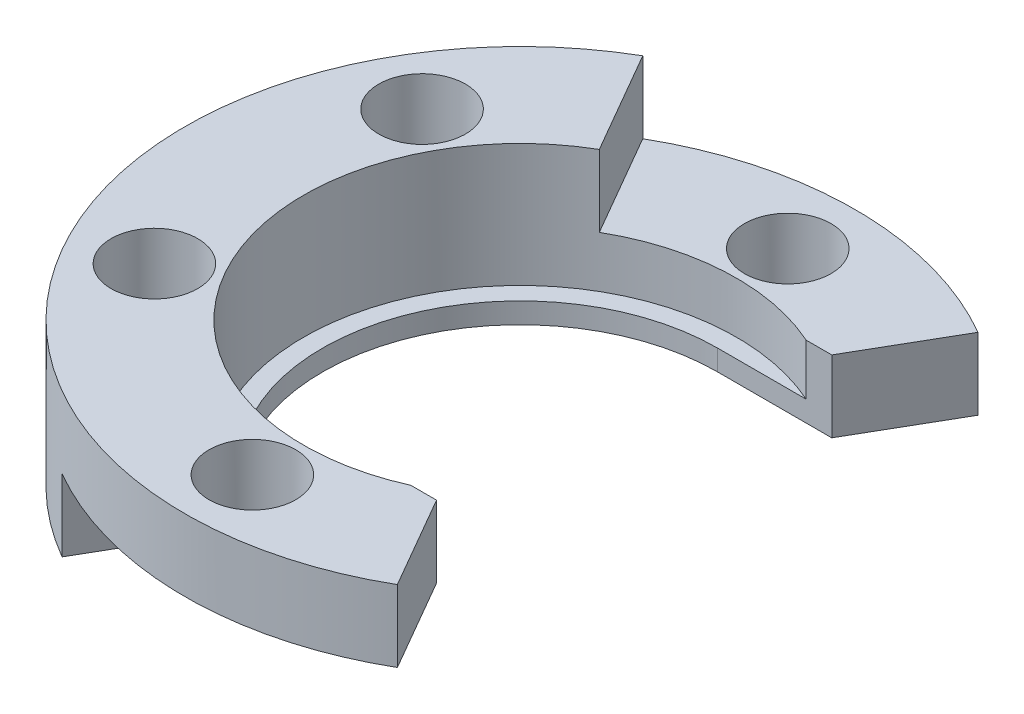
ISO-10303-21;
HEADER;
FILE_DESCRIPTION(('STEP AP214'),'2;1');
FILE_NAME('part.step','',(''),(''),'','','');
FILE_SCHEMA(('AUTOMOTIVE_DESIGN { 1 0 10303 214 1 1 1 1 }'));
ENDSEC;
DATA;
#1=APPLICATION_CONTEXT('core data for automotive mechanical design processes');
#2=APPLICATION_PROTOCOL_DEFINITION('international standard','automotive_design',2000,#1);
#3=PRODUCT_CONTEXT('',#1,'mechanical');
#4=PRODUCT('Part','Part','',(#3));
#5=PRODUCT_RELATED_PRODUCT_CATEGORY('part','',(#4));
#6=PRODUCT_DEFINITION_FORMATION('','',#4);
#7=PRODUCT_DEFINITION_CONTEXT('part definition',#1,'design');
#8=PRODUCT_DEFINITION('design','',#6,#7);
#9=PRODUCT_DEFINITION_SHAPE('','',#8);
#10=(LENGTH_UNIT() NAMED_UNIT(*) SI_UNIT(.MILLI.,.METRE.));
#11=(NAMED_UNIT(*) PLANE_ANGLE_UNIT() SI_UNIT($,.RADIAN.));
#12=(NAMED_UNIT(*) SI_UNIT($,.STERADIAN.) SOLID_ANGLE_UNIT());
#13=UNCERTAINTY_MEASURE_WITH_UNIT(LENGTH_MEASURE(1.E-05),#10,'distance_accuracy_value','');
#14=(GEOMETRIC_REPRESENTATION_CONTEXT(3) GLOBAL_UNCERTAINTY_ASSIGNED_CONTEXT((#13)) GLOBAL_UNIT_ASSIGNED_CONTEXT((#10,
#11,#12)) REPRESENTATION_CONTEXT('',''));
#15=CARTESIAN_POINT('',(0.,0.,0.));
#16=DIRECTION('',(0.,0.,1.));
#17=DIRECTION('',(1.,0.,0.));
#18=AXIS2_PLACEMENT_3D('',#15,#16,#17);
#19=CARTESIAN_POINT('',(0.,7.239,0.));
#20=DIRECTION('',(0.,-1.,0.));
#21=DIRECTION('',(0.,0.,-1.));
#22=AXIS2_PLACEMENT_3D('',#19,#20,#21);
#23=CYLINDRICAL_SURFACE('',#22,16.891);
#24=CARTESIAN_POINT('',(0.,0.,0.));
#25=DIRECTION('',(0.,1.,0.));
#26=DIRECTION('',(0.,0.,1.));
#27=AXIS2_PLACEMENT_3D('',#24,#25,#26);
#28=CIRCLE('',#27,16.891);
#29=CARTESIAN_POINT('',(8.44550000000007,0.,-14.6280350953229));
#30=VERTEX_POINT('',#29);
#31=CARTESIAN_POINT('',(-8.44549999999993,0.,14.628035095323));
#32=VERTEX_POINT('',#31);
#33=EDGE_CURVE('E136',#30,#32,#28,.T.);
#34=ORIENTED_EDGE('',*,*,#33,.T.);
#35=DIRECTION('',(0.,-1.,0.));
#36=VECTOR('',#35,1.);
#37=CARTESIAN_POINT('',(-8.44549999999993,7.239,14.628035095323));
#38=LINE('',#37,#36);
#39=CARTESIAN_POINT('',(-8.44549999999993,3.6195,14.628035095323));
#40=VERTEX_POINT('',#39);
#41=EDGE_CURVE('E119',#32,#40,#38,.F.);
#42=ORIENTED_EDGE('',*,*,#41,.T.);
#43=CARTESIAN_POINT('',(0.,3.6195,0.));
#44=DIRECTION('',(0.,1.,0.));
#45=DIRECTION('',(0.,0.,1.));
#46=AXIS2_PLACEMENT_3D('',#43,#44,#45);
#47=CIRCLE('',#46,16.891);
#48=CARTESIAN_POINT('',(8.44550000000004,3.6195,14.6280350953229));
#49=VERTEX_POINT('',#48);
#50=EDGE_CURVE('E165',#40,#49,#47,.T.);
#51=ORIENTED_EDGE('',*,*,#50,.T.);
#52=DIRECTION('',(0.,-1.,0.));
#53=VECTOR('',#52,1.);
#54=CARTESIAN_POINT('',(8.44550000000007,7.239,14.6280350953229));
#55=LINE('',#54,#53);
#56=CARTESIAN_POINT('',(8.44550000000007,7.239,14.6280350953229));
#57=VERTEX_POINT('',#56);
#58=EDGE_CURVE('E171',#57,#49,#55,.T.);
#59=ORIENTED_EDGE('',*,*,#58,.F.);
#60=CARTESIAN_POINT('',(0.,7.239,0.));
#61=DIRECTION('',(0.,1.,0.));
#62=DIRECTION('',(0.,0.,1.));
#63=AXIS2_PLACEMENT_3D('',#60,#61,#62);
#64=CIRCLE('',#63,16.891);
#65=CARTESIAN_POINT('',(-8.44549999999993,7.239,-14.628035095323));
#66=VERTEX_POINT('',#65);
#67=EDGE_CURVE('E144',#66,#57,#64,.T.);
#68=ORIENTED_EDGE('',*,*,#67,.F.);
#69=DIRECTION('',(0.,-1.,0.));
#70=VECTOR('',#69,1.);
#71=CARTESIAN_POINT('',(-8.44549999999993,7.239,-14.628035095323));
#72=LINE('',#71,#70);
#73=CARTESIAN_POINT('',(-8.44549999999993,3.6195,-14.628035095323));
#74=VERTEX_POINT('',#73);
#75=EDGE_CURVE('E181',#66,#74,#72,.T.);
#76=ORIENTED_EDGE('',*,*,#75,.T.);
#77=CARTESIAN_POINT('',(0.,3.6195,0.));
#78=DIRECTION('',(0.,-1.,0.));
#79=DIRECTION('',(0.,0.,-1.));
#80=AXIS2_PLACEMENT_3D('',#77,#78,#79);
#81=CIRCLE('',#80,16.891);
#82=CARTESIAN_POINT('',(8.44550000000006,3.6195,-14.6280350953229));
#83=VERTEX_POINT('',#82);
#84=EDGE_CURVE('E253',#74,#83,#81,.T.);
#85=ORIENTED_EDGE('',*,*,#84,.T.);
#86=DIRECTION('',(0.,-1.,0.));
#87=VECTOR('',#86,1.);
#88=CARTESIAN_POINT('',(8.44550000000007,7.239,-14.6280350953229));
#89=LINE('',#88,#87);
#90=EDGE_CURVE('E142',#83,#30,#89,.T.);
#91=ORIENTED_EDGE('',*,*,#90,.T.);
#92=EDGE_LOOP('',(#34,#42,#51,#59,#68,#76,#85,#91));
#93=FACE_BOUND('',#92,.T.);
#94=ADVANCED_FACE('F31',(#93),#23,.T.);
#95=CARTESIAN_POINT('',(0.,7.239,0.));
#96=DIRECTION('',(0.,1.,0.));
#97=DIRECTION('',(0.,0.,1.));
#98=AXIS2_PLACEMENT_3D('',#95,#96,#97);
#99=PLANE('',#98);
#100=DIRECTION('',(0.499999999999996,0.,0.866025403784441));
#101=VECTOR('',#100,1.);
#102=CARTESIAN_POINT('',(0.,7.239,0.));
#103=LINE('',#102,#101);
#104=CARTESIAN_POINT('',(-5.45464999999996,7.239,-9.44773093750561));
#105=VERTEX_POINT('',#104);
#106=EDGE_CURVE('E128',#66,#105,#103,.T.);
#107=ORIENTED_EDGE('',*,*,#106,.F.);
#108=ORIENTED_EDGE('',*,*,#67,.T.);
#109=DIRECTION('',(-0.500000000000004,0.,-0.866025403784436));
#110=VECTOR('',#109,1.);
#111=CARTESIAN_POINT('',(17.0252117329581,7.239,29.4885317311009));
#112=LINE('',#111,#110);
#113=CARTESIAN_POINT('',(5.74856116026733,7.239,9.9568));
#114=VERTEX_POINT('',#113);
#115=EDGE_CURVE('E177',#57,#114,#112,.T.);
#116=ORIENTED_EDGE('',*,*,#115,.T.);
#117=DIRECTION('',(1.,0.,0.));
#118=VECTOR('',#117,1.);
#119=CARTESIAN_POINT('',(23.3834472135491,7.239,9.9568));
#120=LINE('',#119,#118);
#121=CARTESIAN_POINT('',(4.4581341668909,7.239,9.9568));
#122=VERTEX_POINT('',#121);
#123=EDGE_CURVE('E186',#122,#114,#120,.T.);
#124=ORIENTED_EDGE('',*,*,#123,.F.);
#125=CARTESIAN_POINT('',(0.,7.239,0.));
#126=DIRECTION('',(0.,-1.,0.));
#127=DIRECTION('',(0.,0.,-1.));
#128=AXIS2_PLACEMENT_3D('',#125,#126,#127);
#129=CIRCLE('',#128,10.9093);
#130=EDGE_CURVE('E145',#122,#105,#129,.T.);
#131=ORIENTED_EDGE('',*,*,#130,.T.);
#132=EDGE_LOOP('',(#107,#108,#116,#124,#131));
#133=FACE_BOUND('',#132,.T.);
#134=CARTESIAN_POINT('',(0.,7.239,13.4874));
#135=DIRECTION('',(0.,1.,0.));
#136=DIRECTION('',(0.,0.,-1.));
#137=AXIS2_PLACEMENT_3D('',#134,#135,#136);
#138=CIRCLE('',#137,2.1844);
#139=CARTESIAN_POINT('',(0.,7.239,11.303));
#140=VERTEX_POINT('',#139);
#141=EDGE_CURVE('E213',#140,#140,#138,.T.);
#142=ORIENTED_EDGE('',*,*,#141,.F.);
#143=EDGE_LOOP('',(#142));
#144=FACE_BOUND('',#143,.T.);
#145=CARTESIAN_POINT('',(-11.6804310310023,7.239,6.74369999999989));
#146=DIRECTION('',(0.,1.,0.));
#147=DIRECTION('',(0.866025403784443,0.,-0.499999999999992));
#148=AXIS2_PLACEMENT_3D('',#145,#146,#147);
#149=CIRCLE('',#148,2.1844);
#150=CARTESIAN_POINT('',(-9.78868513897556,7.239,5.65149999999991));
#151=VERTEX_POINT('',#150);
#152=EDGE_CURVE('E207',#151,#151,#149,.T.);
#153=ORIENTED_EDGE('',*,*,#152,.F.);
#154=EDGE_LOOP('',(#153));
#155=FACE_BOUND('',#154,.T.);
#156=CARTESIAN_POINT('',(-11.6804310310022,7.239,-6.74370000000014));
#157=DIRECTION('',(0.,1.,0.));
#158=DIRECTION('',(0.866025403784433,0.,0.50000000000001));
#159=AXIS2_PLACEMENT_3D('',#156,#157,#158);
#160=CIRCLE('',#159,2.1844);
#161=CARTESIAN_POINT('',(-9.78868513897544,7.239,-5.65150000000011));
#162=VERTEX_POINT('',#161);
#163=EDGE_CURVE('E203',#162,#162,#160,.T.);
#164=ORIENTED_EDGE('',*,*,#163,.F.);
#165=EDGE_LOOP('',(#164));
#166=FACE_BOUND('',#165,.T.);
#167=ADVANCED_FACE('F260',(#133,#144,#155,#166),#99,.T.);
#168=CARTESIAN_POINT('',(0.,0.,0.));
#169=DIRECTION('',(0.,1.,0.));
#170=DIRECTION('',(0.,0.,1.));
#171=AXIS2_PLACEMENT_3D('',#168,#169,#170);
#172=PLANE('',#171);
#173=CARTESIAN_POINT('',(0.,0.,-13.4874));
#174=DIRECTION('',(0.,1.,0.));
#175=DIRECTION('',(0.,0.,1.));
#176=AXIS2_PLACEMENT_3D('',#173,#174,#175);
#177=CIRCLE('',#176,2.1844);
#178=CARTESIAN_POINT('',(0.,0.,-11.303));
#179=VERTEX_POINT('',#178);
#180=EDGE_CURVE('E218',#179,#179,#177,.T.);
#181=ORIENTED_EDGE('',*,*,#180,.T.);
#182=EDGE_LOOP('',(#181));
#183=FACE_BOUND('',#182,.T.);
#184=CARTESIAN_POINT('',(-11.6804310310023,0.,6.74369999999989));
#185=DIRECTION('',(0.,1.,0.));
#186=DIRECTION('',(0.866025403784443,0.,-0.499999999999992));
#187=AXIS2_PLACEMENT_3D('',#184,#185,#186);
#188=CIRCLE('',#187,2.1844);
#189=CARTESIAN_POINT('',(-9.78868513897556,0.,5.65149999999991));
#190=VERTEX_POINT('',#189);
#191=EDGE_CURVE('E210',#190,#190,#188,.T.);
#192=ORIENTED_EDGE('',*,*,#191,.T.);
#193=EDGE_LOOP('',(#192));
#194=FACE_BOUND('',#193,.T.);
#195=CARTESIAN_POINT('',(-11.6804310310022,0.,-6.74370000000014));
#196=DIRECTION('',(0.,1.,0.));
#197=DIRECTION('',(0.866025403784433,0.,0.50000000000001));
#198=AXIS2_PLACEMENT_3D('',#195,#196,#197);
#199=CIRCLE('',#198,2.1844);
#200=CARTESIAN_POINT('',(-9.78868513897544,0.,-5.65150000000011));
#201=VERTEX_POINT('',#200);
#202=EDGE_CURVE('E204',#201,#201,#199,.T.);
#203=ORIENTED_EDGE('',*,*,#202,.T.);
#204=EDGE_LOOP('',(#203));
#205=FACE_BOUND('',#204,.T.);
#206=CARTESIAN_POINT('',(0.,0.,0.));
#207=DIRECTION('',(0.,-1.,0.));
#208=DIRECTION('',(0.,0.,-1.));
#209=AXIS2_PLACEMENT_3D('',#206,#207,#208);
#210=CIRCLE('',#209,9.9568);
#211=CARTESIAN_POINT('',(-4.97839999999996,0.,8.62284174040092));
#212=VERTEX_POINT('',#211);
#213=CARTESIAN_POINT('',(0.,0.,-9.9568));
#214=VERTEX_POINT('',#213);
#215=EDGE_CURVE('E138',#212,#214,#210,.T.);
#216=ORIENTED_EDGE('',*,*,#215,.F.);
#217=DIRECTION('',(0.499999999999996,0.,-0.866025403784441));
#218=VECTOR('',#217,1.);
#219=CARTESIAN_POINT('',(0.,0.,0.));
#220=LINE('',#219,#218);
#221=EDGE_CURVE('E122',#32,#212,#220,.T.);
#222=ORIENTED_EDGE('',*,*,#221,.F.);
#223=ORIENTED_EDGE('',*,*,#33,.F.);
#224=DIRECTION('',(-0.500000000000004,0.,0.866025403784436));
#225=VECTOR('',#224,1.);
#226=CARTESIAN_POINT('',(17.0252117329581,0.,-29.4885317311009));
#227=LINE('',#226,#225);
#228=CARTESIAN_POINT('',(5.74856116026733,0.,-9.9568));
#229=VERTEX_POINT('',#228);
#230=EDGE_CURVE('E178',#30,#229,#227,.T.);
#231=ORIENTED_EDGE('',*,*,#230,.T.);
#232=DIRECTION('',(-1.,0.,0.));
#233=VECTOR('',#232,1.);
#234=CARTESIAN_POINT('',(0.,0.,-9.9568));
#235=LINE('',#234,#233);
#236=EDGE_CURVE('E187',#229,#214,#235,.T.);
#237=ORIENTED_EDGE('',*,*,#236,.T.);
#238=EDGE_LOOP('',(#216,#222,#223,#231,#237));
#239=FACE_BOUND('',#238,.T.);
#240=ADVANCED_FACE('F134',(#183,#194,#205,#239),#172,.F.);
#241=CARTESIAN_POINT('',(23.3834472135491,0.,9.9568));
#242=DIRECTION('',(0.,0.,1.));
#243=DIRECTION('',(1.,0.,0.));
#244=AXIS2_PLACEMENT_3D('',#241,#242,#243);
#245=PLANE('',#244);
#246=DIRECTION('',(0.,1.,0.));
#247=VECTOR('',#246,1.);
#248=CARTESIAN_POINT('',(5.74856116026733,0.,9.9568));
#249=LINE('',#248,#247);
#250=CARTESIAN_POINT('',(5.74856116026733,3.6195,9.9568));
#251=VERTEX_POINT('',#250);
#252=EDGE_CURVE('E158',#251,#114,#249,.T.);
#253=ORIENTED_EDGE('',*,*,#252,.F.);
#254=DIRECTION('',(-1.,0.,0.));
#255=VECTOR('',#254,1.);
#256=CARTESIAN_POINT('',(23.3834472135491,3.6195,9.9568));
#257=LINE('',#256,#255);
#258=CARTESIAN_POINT('',(4.4581341668909,3.6195,9.9568));
#259=VERTEX_POINT('',#258);
#260=EDGE_CURVE('E45',#251,#259,#257,.T.);
#261=ORIENTED_EDGE('',*,*,#260,.T.);
#262=DIRECTION('',(0.,-1.,0.));
#263=VECTOR('',#262,1.);
#264=CARTESIAN_POINT('',(4.4581341668909,7.239,9.9568));
#265=LINE('',#264,#263);
#266=EDGE_CURVE('E194',#122,#259,#265,.T.);
#267=ORIENTED_EDGE('',*,*,#266,.F.);
#268=ORIENTED_EDGE('',*,*,#123,.T.);
#269=EDGE_LOOP('',(#253,#261,#267,#268));
#270=FACE_BOUND('',#269,.T.);
#271=ADVANCED_FACE('F284',(#270),#245,.F.);
#272=CARTESIAN_POINT('',(0.,7.239,0.));
#273=DIRECTION('',(0.,-1.,0.));
#274=DIRECTION('',(0.,0.,-1.));
#275=AXIS2_PLACEMENT_3D('',#272,#273,#274);
#276=CYLINDRICAL_SURFACE('',#275,10.9093);
#277=CARTESIAN_POINT('',(0.,3.6195,0.));
#278=DIRECTION('',(0.,1.,0.));
#279=DIRECTION('',(0.,0.,1.));
#280=AXIS2_PLACEMENT_3D('',#277,#278,#279);
#281=CIRCLE('',#280,10.9093);
#282=CARTESIAN_POINT('',(-5.45464999999996,3.6195,9.44773093750561));
#283=VERTEX_POINT('',#282);
#284=EDGE_CURVE('E239',#259,#283,#281,.F.);
#285=ORIENTED_EDGE('',*,*,#284,.T.);
#286=DIRECTION('',(0.,-1.,0.));
#287=VECTOR('',#286,1.);
#288=CARTESIAN_POINT('',(-5.45464999999996,7.239,9.44773093750561));
#289=LINE('',#288,#287);
#290=CARTESIAN_POINT('',(-5.45464999999996,1.0414,9.44773093750561));
#291=VERTEX_POINT('',#290);
#292=EDGE_CURVE('E129',#283,#291,#289,.T.);
#293=ORIENTED_EDGE('',*,*,#292,.T.);
#294=CARTESIAN_POINT('',(0.,1.0414,0.));
#295=DIRECTION('',(0.,-1.,0.));
#296=DIRECTION('',(0.,0.,-1.));
#297=AXIS2_PLACEMENT_3D('',#294,#295,#296);
#298=CIRCLE('',#297,10.9093);
#299=CARTESIAN_POINT('',(4.4581341668909,1.0414,-9.9568));
#300=VERTEX_POINT('',#299);
#301=EDGE_CURVE('E147',#300,#291,#298,.F.);
#302=ORIENTED_EDGE('',*,*,#301,.F.);
#303=DIRECTION('',(0.,-1.,0.));
#304=VECTOR('',#303,1.);
#305=CARTESIAN_POINT('',(4.4581341668909,7.239,-9.9568));
#306=LINE('',#305,#304);
#307=CARTESIAN_POINT('',(4.4581341668909,3.6195,-9.9568));
#308=VERTEX_POINT('',#307);
#309=EDGE_CURVE('E200',#300,#308,#306,.F.);
#310=ORIENTED_EDGE('',*,*,#309,.T.);
#311=CARTESIAN_POINT('',(0.,3.6195,0.));
#312=DIRECTION('',(0.,-1.,0.));
#313=DIRECTION('',(0.,0.,-1.));
#314=AXIS2_PLACEMENT_3D('',#311,#312,#313);
#315=CIRCLE('',#314,10.9093);
#316=CARTESIAN_POINT('',(-5.45464999999996,3.6195,-9.44773093750561));
#317=VERTEX_POINT('',#316);
#318=EDGE_CURVE('E248',#308,#317,#315,.F.);
#319=ORIENTED_EDGE('',*,*,#318,.T.);
#320=DIRECTION('',(0.,-1.,0.));
#321=VECTOR('',#320,1.);
#322=CARTESIAN_POINT('',(-5.45464999999996,7.239,-9.44773093750561));
#323=LINE('',#322,#321);
#324=EDGE_CURVE('E162',#317,#105,#323,.F.);
#325=ORIENTED_EDGE('',*,*,#324,.T.);
#326=ORIENTED_EDGE('',*,*,#130,.F.);
#327=ORIENTED_EDGE('',*,*,#266,.T.);
#328=EDGE_LOOP('',(#285,#293,#302,#310,#319,#325,#326,#327));
#329=FACE_BOUND('',#328,.T.);
#330=ADVANCED_FACE('F237',(#329),#276,.F.);
#331=CARTESIAN_POINT('',(0.,1.0414,0.));
#332=DIRECTION('',(0.,-1.,0.));
#333=DIRECTION('',(0.,0.,-1.));
#334=AXIS2_PLACEMENT_3D('',#331,#332,#333);
#335=PLANE('',#334);
#336=ORIENTED_EDGE('',*,*,#301,.T.);
#337=DIRECTION('',(0.499999999999996,0.,-0.866025403784441));
#338=VECTOR('',#337,1.);
#339=CARTESIAN_POINT('',(0.,1.0414,0.));
#340=LINE('',#339,#338);
#341=CARTESIAN_POINT('',(-4.97839999999996,1.0414,8.62284174040092));
#342=VERTEX_POINT('',#341);
#343=EDGE_CURVE('E172',#291,#342,#340,.T.);
#344=ORIENTED_EDGE('',*,*,#343,.T.);
#345=CARTESIAN_POINT('',(0.,1.0414,0.));
#346=DIRECTION('',(0.,-1.,0.));
#347=DIRECTION('',(0.,0.,-1.));
#348=AXIS2_PLACEMENT_3D('',#345,#346,#347);
#349=CIRCLE('',#348,9.9568);
#350=CARTESIAN_POINT('',(0.,1.0414,-9.9568));
#351=VERTEX_POINT('',#350);
#352=EDGE_CURVE('E150',#342,#351,#349,.T.);
#353=ORIENTED_EDGE('',*,*,#352,.T.);
#354=DIRECTION('',(1.,0.,0.));
#355=VECTOR('',#354,1.);
#356=CARTESIAN_POINT('',(0.,1.0414,-9.9568));
#357=LINE('',#356,#355);
#358=EDGE_CURVE('E197',#351,#300,#357,.T.);
#359=ORIENTED_EDGE('',*,*,#358,.T.);
#360=EDGE_LOOP('',(#336,#344,#353,#359));
#361=FACE_BOUND('',#360,.T.);
#362=ADVANCED_FACE('F232',(#361),#335,.F.);
#363=CARTESIAN_POINT('',(0.,1.0414,0.));
#364=DIRECTION('',(0.,-1.,0.));
#365=DIRECTION('',(0.,0.,-1.));
#366=AXIS2_PLACEMENT_3D('',#363,#364,#365);
#367=CYLINDRICAL_SURFACE('',#366,9.9568);
#368=ORIENTED_EDGE('',*,*,#352,.F.);
#369=DIRECTION('',(0.,-1.,0.));
#370=VECTOR('',#369,1.);
#371=CARTESIAN_POINT('',(-4.97839999999996,1.0414,8.62284174040092));
#372=LINE('',#371,#370);
#373=EDGE_CURVE('E11',#342,#212,#372,.T.);
#374=ORIENTED_EDGE('',*,*,#373,.T.);
#375=ORIENTED_EDGE('',*,*,#215,.T.);
#376=DIRECTION('',(0.,1.,0.));
#377=VECTOR('',#376,1.);
#378=CARTESIAN_POINT('',(0.,0.,-9.9568));
#379=LINE('',#378,#377);
#380=EDGE_CURVE('E189',#214,#351,#379,.T.);
#381=ORIENTED_EDGE('',*,*,#380,.T.);
#382=EDGE_LOOP('',(#368,#374,#375,#381));
#383=FACE_BOUND('',#382,.T.);
#384=ADVANCED_FACE('F224',(#383),#367,.F.);
#385=CARTESIAN_POINT('',(0.,0.,-13.4874));
#386=DIRECTION('',(0.,1.,0.));
#387=DIRECTION('',(0.,0.,1.));
#388=AXIS2_PLACEMENT_3D('',#385,#386,#387);
#389=CYLINDRICAL_SURFACE('',#388,2.1844);
#390=CARTESIAN_POINT('',(0.,3.6195,-13.4874));
#391=DIRECTION('',(0.,-1.,0.));
#392=DIRECTION('',(0.,0.,-1.));
#393=AXIS2_PLACEMENT_3D('',#390,#391,#392);
#394=CIRCLE('',#393,2.1844);
#395=CARTESIAN_POINT('',(0.,3.6195,-15.6718));
#396=VERTEX_POINT('',#395);
#397=EDGE_CURVE('E250',#396,#396,#394,.F.);
#398=ORIENTED_EDGE('',*,*,#397,.T.);
#399=EDGE_LOOP('',(#398));
#400=FACE_BOUND('',#399,.T.);
#401=ORIENTED_EDGE('',*,*,#180,.F.);
#402=EDGE_LOOP('',(#401));
#403=FACE_BOUND('',#402,.T.);
#404=ADVANCED_FACE('F293',(#400,#403),#389,.F.);
#405=CARTESIAN_POINT('',(0.,0.,13.4874));
#406=DIRECTION('',(0.,1.,0.));
#407=DIRECTION('',(0.,0.,1.));
#408=AXIS2_PLACEMENT_3D('',#405,#406,#407);
#409=CYLINDRICAL_SURFACE('',#408,2.1844);
#410=CARTESIAN_POINT('',(0.,3.6195,13.4874));
#411=DIRECTION('',(0.,1.,0.));
#412=DIRECTION('',(0.,0.,1.));
#413=AXIS2_PLACEMENT_3D('',#410,#411,#412);
#414=CIRCLE('',#413,2.1844);
#415=CARTESIAN_POINT('',(0.,3.6195,15.6718));
#416=VERTEX_POINT('',#415);
#417=EDGE_CURVE('E313',#416,#416,#414,.F.);
#418=ORIENTED_EDGE('',*,*,#417,.T.);
#419=EDGE_LOOP('',(#418));
#420=FACE_BOUND('',#419,.T.);
#421=ORIENTED_EDGE('',*,*,#141,.T.);
#422=EDGE_LOOP('',(#421));
#423=FACE_BOUND('',#422,.T.);
#424=ADVANCED_FACE('F296',(#420,#423),#409,.F.);
#425=CARTESIAN_POINT('',(-11.6804310310023,0.,6.74369999999989));
#426=DIRECTION('',(0.,1.,0.));
#427=DIRECTION('',(0.,0.,1.));
#428=AXIS2_PLACEMENT_3D('',#425,#426,#427);
#429=CYLINDRICAL_SURFACE('',#428,2.1844);
#430=ORIENTED_EDGE('',*,*,#191,.F.);
#431=EDGE_LOOP('',(#430));
#432=FACE_BOUND('',#431,.T.);
#433=ORIENTED_EDGE('',*,*,#152,.T.);
#434=EDGE_LOOP('',(#433));
#435=FACE_BOUND('',#434,.T.);
#436=ADVANCED_FACE('F300',(#432,#435),#429,.F.);
#437=CARTESIAN_POINT('',(-11.6804310310022,0.,-6.74370000000014));
#438=DIRECTION('',(0.,1.,0.));
#439=DIRECTION('',(0.,0.,1.));
#440=AXIS2_PLACEMENT_3D('',#437,#438,#439);
#441=CYLINDRICAL_SURFACE('',#440,2.1844);
#442=ORIENTED_EDGE('',*,*,#202,.F.);
#443=EDGE_LOOP('',(#442));
#444=FACE_BOUND('',#443,.T.);
#445=ORIENTED_EDGE('',*,*,#163,.T.);
#446=EDGE_LOOP('',(#445));
#447=FACE_BOUND('',#446,.T.);
#448=ADVANCED_FACE('F274',(#444,#447),#441,.F.);
#449=CARTESIAN_POINT('',(0.,0.,-9.9568));
#450=DIRECTION('',(0.,0.,-1.));
#451=DIRECTION('',(-1.,0.,0.));
#452=AXIS2_PLACEMENT_3D('',#449,#450,#451);
#453=PLANE('',#452);
#454=DIRECTION('',(0.,1.,0.));
#455=VECTOR('',#454,1.);
#456=CARTESIAN_POINT('',(5.74856116026733,0.,-9.9568));
#457=LINE('',#456,#455);
#458=CARTESIAN_POINT('',(5.74856116026733,3.6195,-9.9568));
#459=VERTEX_POINT('',#458);
#460=EDGE_CURVE('E155',#229,#459,#457,.T.);
#461=ORIENTED_EDGE('',*,*,#460,.T.);
#462=DIRECTION('',(-1.,0.,0.));
#463=VECTOR('',#462,1.);
#464=CARTESIAN_POINT('',(0.,3.6195,-9.9568));
#465=LINE('',#464,#463);
#466=EDGE_CURVE('E53',#459,#308,#465,.T.);
#467=ORIENTED_EDGE('',*,*,#466,.T.);
#468=ORIENTED_EDGE('',*,*,#309,.F.);
#469=ORIENTED_EDGE('',*,*,#358,.F.);
#470=ORIENTED_EDGE('',*,*,#380,.F.);
#471=ORIENTED_EDGE('',*,*,#236,.F.);
#472=EDGE_LOOP('',(#461,#467,#468,#469,#470,#471));
#473=FACE_BOUND('',#472,.T.);
#474=ADVANCED_FACE('F229',(#473),#453,.F.);
#475=CARTESIAN_POINT('',(17.0252117329581,0.,-29.4885317311009));
#476=DIRECTION('',(-0.866025403784436,0.,-0.500000000000004));
#477=DIRECTION('',(-0.500000000000004,0.,0.866025403784436));
#478=AXIS2_PLACEMENT_3D('',#475,#476,#477);
#479=PLANE('',#478);
#480=ORIENTED_EDGE('',*,*,#90,.F.);
#481=DIRECTION('',(-0.500000000000004,0.,0.866025403784436));
#482=VECTOR('',#481,1.);
#483=CARTESIAN_POINT('',(17.0252117329581,3.6195,-29.4885317311009));
#484=LINE('',#483,#482);
#485=EDGE_CURVE('E160',#83,#459,#484,.T.);
#486=ORIENTED_EDGE('',*,*,#485,.T.);
#487=ORIENTED_EDGE('',*,*,#460,.F.);
#488=ORIENTED_EDGE('',*,*,#230,.F.);
#489=EDGE_LOOP('',(#480,#486,#487,#488));
#490=FACE_BOUND('',#489,.T.);
#491=ADVANCED_FACE('F266',(#490),#479,.F.);
#492=CARTESIAN_POINT('',(17.0252117329581,0.,29.4885317311009));
#493=DIRECTION('',(0.866025403784436,0.,-0.500000000000004));
#494=DIRECTION('',(-0.500000000000004,0.,-0.866025403784436));
#495=AXIS2_PLACEMENT_3D('',#492,#493,#494);
#496=PLANE('',#495);
#497=DIRECTION('',(0.500000000000004,0.,0.866025403784436));
#498=VECTOR('',#497,1.);
#499=CARTESIAN_POINT('',(17.0252117329581,3.6195,29.4885317311009));
#500=LINE('',#499,#498);
#501=EDGE_CURVE('E38',#251,#49,#500,.T.);
#502=ORIENTED_EDGE('',*,*,#501,.F.);
#503=ORIENTED_EDGE('',*,*,#252,.T.);
#504=ORIENTED_EDGE('',*,*,#115,.F.);
#505=ORIENTED_EDGE('',*,*,#58,.T.);
#506=EDGE_LOOP('',(#502,#503,#504,#505));
#507=FACE_BOUND('',#506,.T.);
#508=ADVANCED_FACE('F175',(#507),#496,.T.);
#509=CARTESIAN_POINT('',(0.,3.6195,0.));
#510=DIRECTION('',(-0.866025403784441,0.,0.499999999999996));
#511=DIRECTION('',(0.499999999999996,0.,0.866025403784441));
#512=AXIS2_PLACEMENT_3D('',#509,#510,#511);
#513=PLANE('',#512);
#514=ORIENTED_EDGE('',*,*,#106,.T.);
#515=ORIENTED_EDGE('',*,*,#324,.F.);
#516=DIRECTION('',(0.499999999999996,0.,0.866025403784441));
#517=VECTOR('',#516,1.);
#518=CARTESIAN_POINT('',(0.,3.6195,0.));
#519=LINE('',#518,#517);
#520=EDGE_CURVE('E243',#74,#317,#519,.T.);
#521=ORIENTED_EDGE('',*,*,#520,.F.);
#522=ORIENTED_EDGE('',*,*,#75,.F.);
#523=EDGE_LOOP('',(#514,#515,#521,#522));
#524=FACE_BOUND('',#523,.T.);
#525=ADVANCED_FACE('F258',(#524),#513,.F.);
#526=CARTESIAN_POINT('',(0.,3.6195,0.));
#527=DIRECTION('',(0.,-1.,0.));
#528=DIRECTION('',(0.,0.,-1.));
#529=AXIS2_PLACEMENT_3D('',#526,#527,#528);
#530=PLANE('',#529);
#531=ORIENTED_EDGE('',*,*,#397,.F.);
#532=EDGE_LOOP('',(#531));
#533=FACE_BOUND('',#532,.T.);
#534=ORIENTED_EDGE('',*,*,#520,.T.);
#535=ORIENTED_EDGE('',*,*,#318,.F.);
#536=ORIENTED_EDGE('',*,*,#466,.F.);
#537=ORIENTED_EDGE('',*,*,#485,.F.);
#538=ORIENTED_EDGE('',*,*,#84,.F.);
#539=EDGE_LOOP('',(#534,#535,#536,#537,#538));
#540=FACE_BOUND('',#539,.T.);
#541=ADVANCED_FACE('F264',(#533,#540),#530,.F.);
#542=CARTESIAN_POINT('',(0.,3.6195,0.));
#543=DIRECTION('',(-0.866025403784441,0.,-0.499999999999996));
#544=DIRECTION('',(-0.499999999999996,0.,0.866025403784441));
#545=AXIS2_PLACEMENT_3D('',#542,#543,#544);
#546=PLANE('',#545);
#547=ORIENTED_EDGE('',*,*,#221,.T.);
#548=ORIENTED_EDGE('',*,*,#373,.F.);
#549=ORIENTED_EDGE('',*,*,#343,.F.);
#550=ORIENTED_EDGE('',*,*,#292,.F.);
#551=DIRECTION('',(0.499999999999996,0.,-0.866025403784441));
#552=VECTOR('',#551,1.);
#553=CARTESIAN_POINT('',(0.,3.6195,0.));
#554=LINE('',#553,#552);
#555=EDGE_CURVE('E124',#40,#283,#554,.T.);
#556=ORIENTED_EDGE('',*,*,#555,.F.);
#557=ORIENTED_EDGE('',*,*,#41,.F.);
#558=EDGE_LOOP('',(#547,#548,#549,#550,#556,#557));
#559=FACE_BOUND('',#558,.T.);
#560=ADVANCED_FACE('F121',(#559),#546,.F.);
#561=CARTESIAN_POINT('',(0.,3.6195,0.));
#562=DIRECTION('',(0.,1.,0.));
#563=DIRECTION('',(0.,0.,1.));
#564=AXIS2_PLACEMENT_3D('',#561,#562,#563);
#565=PLANE('',#564);
#566=ORIENTED_EDGE('',*,*,#417,.F.);
#567=EDGE_LOOP('',(#566));
#568=FACE_BOUND('',#567,.T.);
#569=ORIENTED_EDGE('',*,*,#555,.T.);
#570=ORIENTED_EDGE('',*,*,#284,.F.);
#571=ORIENTED_EDGE('',*,*,#260,.F.);
#572=ORIENTED_EDGE('',*,*,#501,.T.);
#573=ORIENTED_EDGE('',*,*,#50,.F.);
#574=EDGE_LOOP('',(#569,#570,#571,#572,#573));
#575=FACE_BOUND('',#574,.T.);
#576=ADVANCED_FACE('F164',(#568,#575),#565,.F.);
#577=CLOSED_SHELL('',(#94,#167,#240,#271,#330,#362,#384,#404,#424,#436,#448,#474,#491,#508,#525,
#541,#560,#576));
#578=MANIFOLD_SOLID_BREP('B2',#577);
#579=ADVANCED_BREP_SHAPE_REPRESENTATION('',(#18,#578),#14);
#580=SHAPE_DEFINITION_REPRESENTATION(#9,#579);
ENDSEC;
END-ISO-10303-21;
